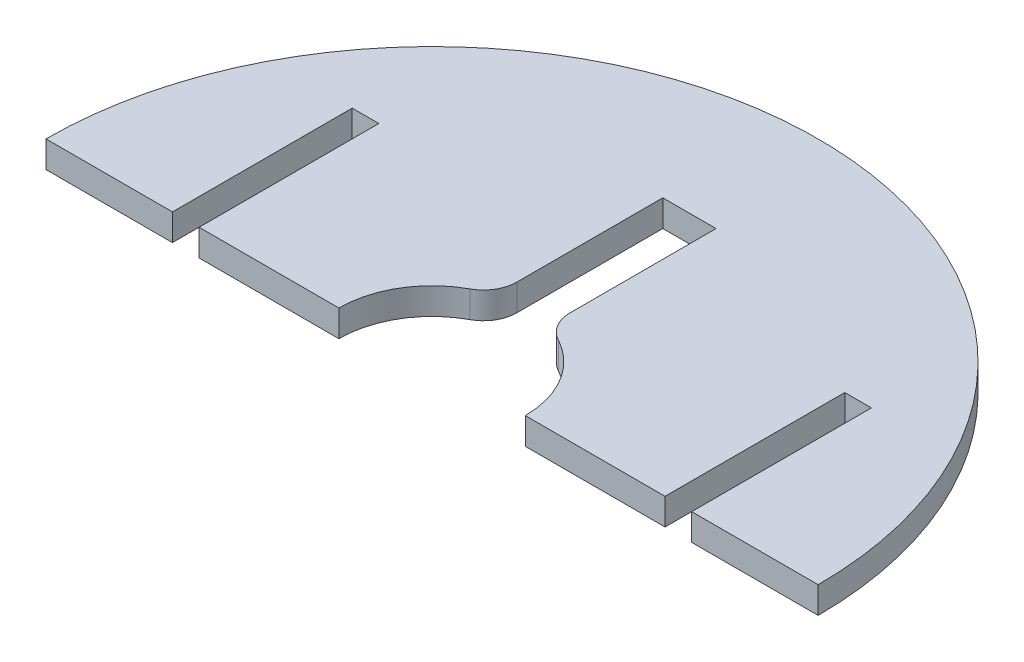
ISO-10303-21;
HEADER;
FILE_DESCRIPTION(('STEP AP214'),'2;1');
FILE_NAME('part.step','',(''),(''),'','','');
FILE_SCHEMA(('AUTOMOTIVE_DESIGN { 1 0 10303 214 1 1 1 1 }'));
ENDSEC;
DATA;
#1=APPLICATION_CONTEXT('core data for automotive mechanical design processes');
#2=APPLICATION_PROTOCOL_DEFINITION('international standard','automotive_design',2000,#1);
#3=PRODUCT_CONTEXT('',#1,'mechanical');
#4=PRODUCT('Part','Part','',(#3));
#5=PRODUCT_RELATED_PRODUCT_CATEGORY('part','',(#4));
#6=PRODUCT_DEFINITION_FORMATION('','',#4);
#7=PRODUCT_DEFINITION_CONTEXT('part definition',#1,'design');
#8=PRODUCT_DEFINITION('design','',#6,#7);
#9=PRODUCT_DEFINITION_SHAPE('','',#8);
#10=(LENGTH_UNIT() NAMED_UNIT(*) SI_UNIT(.MILLI.,.METRE.));
#11=(NAMED_UNIT(*) PLANE_ANGLE_UNIT() SI_UNIT($,.RADIAN.));
#12=(NAMED_UNIT(*) SI_UNIT($,.STERADIAN.) SOLID_ANGLE_UNIT());
#13=UNCERTAINTY_MEASURE_WITH_UNIT(LENGTH_MEASURE(1.E-05),#10,'distance_accuracy_value','');
#14=(GEOMETRIC_REPRESENTATION_CONTEXT(3) GLOBAL_UNCERTAINTY_ASSIGNED_CONTEXT((#13)) GLOBAL_UNIT_ASSIGNED_CONTEXT((#10,
#11,#12)) REPRESENTATION_CONTEXT('',''));
#15=CARTESIAN_POINT('',(0.,0.,0.));
#16=DIRECTION('',(0.,0.,1.));
#17=DIRECTION('',(1.,0.,0.));
#18=AXIS2_PLACEMENT_3D('',#15,#16,#17);
#19=CARTESIAN_POINT('',(-58.,4.,0.));
#20=DIRECTION('',(0.,0.,-1.));
#21=DIRECTION('',(-1.,0.,0.));
#22=AXIS2_PLACEMENT_3D('',#19,#20,#21);
#23=PLANE('',#22);
#24=DIRECTION('',(0.,1.,0.));
#25=VECTOR('',#24,1.);
#26=CARTESIAN_POINT('',(-14.,0.,0.));
#27=LINE('',#26,#25);
#28=CARTESIAN_POINT('',(-14.,0.,0.));
#29=VERTEX_POINT('',#28);
#30=CARTESIAN_POINT('',(-14.,4.,0.));
#31=VERTEX_POINT('',#30);
#32=EDGE_CURVE('E238',#29,#31,#27,.T.);
#33=ORIENTED_EDGE('',*,*,#32,.T.);
#34=DIRECTION('',(1.,0.,0.));
#35=VECTOR('',#34,1.);
#36=CARTESIAN_POINT('',(-58.,4.,0.));
#37=LINE('',#36,#35);
#38=CARTESIAN_POINT('',(-35.,4.,0.));
#39=VERTEX_POINT('',#38);
#40=EDGE_CURVE('E199',#39,#31,#37,.T.);
#41=ORIENTED_EDGE('',*,*,#40,.F.);
#42=DIRECTION('',(0.,1.,0.));
#43=VECTOR('',#42,1.);
#44=CARTESIAN_POINT('',(-35.,0.,0.));
#45=LINE('',#44,#43);
#46=CARTESIAN_POINT('',(-35.,0.,0.));
#47=VERTEX_POINT('',#46);
#48=EDGE_CURVE('E242',#47,#39,#45,.T.);
#49=ORIENTED_EDGE('',*,*,#48,.F.);
#50=DIRECTION('',(1.,0.,0.));
#51=VECTOR('',#50,1.);
#52=CARTESIAN_POINT('',(-58.,0.,0.));
#53=LINE('',#52,#51);
#54=EDGE_CURVE('E180',#47,#29,#53,.T.);
#55=ORIENTED_EDGE('',*,*,#54,.T.);
#56=EDGE_LOOP('',(#33,#41,#49,#55));
#57=FACE_BOUND('',#56,.T.);
#58=ADVANCED_FACE('F33',(#57),#23,.F.);
#59=CARTESIAN_POINT('',(0.,4.,0.));
#60=DIRECTION('',(0.,-1.,0.));
#61=DIRECTION('',(0.,0.,-1.));
#62=AXIS2_PLACEMENT_3D('',#59,#60,#61);
#63=PLANE('',#62);
#64=CARTESIAN_POINT('',(0.,4.,0.));
#65=DIRECTION('',(0.,1.,0.));
#66=DIRECTION('',(0.,0.,1.));
#67=AXIS2_PLACEMENT_3D('',#64,#65,#66);
#68=CIRCLE('',#67,14.);
#69=CARTESIAN_POINT('',(-6.63157894736842,4.,-12.329726706818));
#70=VERTEX_POINT('',#69);
#71=EDGE_CURVE('E167',#31,#70,#68,.F.);
#72=ORIENTED_EDGE('',*,*,#71,.T.);
#73=CARTESIAN_POINT('',(-9.,4.,-16.7332005306815));
#74=DIRECTION('',(0.,1.,0.));
#75=DIRECTION('',(0.,0.,1.));
#76=AXIS2_PLACEMENT_3D('',#73,#74,#75);
#77=CIRCLE('',#76,5.);
#78=CARTESIAN_POINT('',(-4.,4.,-16.7332005306815));
#79=VERTEX_POINT('',#78);
#80=EDGE_CURVE('E302',#70,#79,#77,.T.);
#81=ORIENTED_EDGE('',*,*,#80,.T.);
#82=DIRECTION('',(0.,0.,-1.));
#83=VECTOR('',#82,1.);
#84=CARTESIAN_POINT('',(-3.99999999999999,4.,0.));
#85=LINE('',#84,#83);
#86=CARTESIAN_POINT('',(-4.,4.,-38.6632005306815));
#87=VERTEX_POINT('',#86);
#88=EDGE_CURVE('E305',#79,#87,#85,.T.);
#89=ORIENTED_EDGE('',*,*,#88,.T.);
#90=DIRECTION('',(1.,0.,0.));
#91=VECTOR('',#90,1.);
#92=CARTESIAN_POINT('',(0.,4.,-38.6632005306815));
#93=LINE('',#92,#91);
#94=CARTESIAN_POINT('',(4.,4.,-38.6632005306815));
#95=VERTEX_POINT('',#94);
#96=EDGE_CURVE('E308',#87,#95,#93,.T.);
#97=ORIENTED_EDGE('',*,*,#96,.T.);
#98=DIRECTION('',(0.,0.,-1.));
#99=VECTOR('',#98,1.);
#100=CARTESIAN_POINT('',(4.,4.,0.));
#101=LINE('',#100,#99);
#102=CARTESIAN_POINT('',(4.,4.,-16.7332005306815));
#103=VERTEX_POINT('',#102);
#104=EDGE_CURVE('E311',#103,#95,#101,.T.);
#105=ORIENTED_EDGE('',*,*,#104,.F.);
#106=CARTESIAN_POINT('',(8.99999999999999,4.,-16.7332005306815));
#107=DIRECTION('',(0.,1.,0.));
#108=DIRECTION('',(0.,0.,1.));
#109=AXIS2_PLACEMENT_3D('',#106,#107,#108);
#110=CIRCLE('',#109,5.);
#111=CARTESIAN_POINT('',(6.63157894736842,4.,-12.329726706818));
#112=VERTEX_POINT('',#111);
#113=EDGE_CURVE('E314',#112,#103,#110,.F.);
#114=ORIENTED_EDGE('',*,*,#113,.F.);
#115=CARTESIAN_POINT('',(0.,4.,0.));
#116=DIRECTION('',(0.,1.,0.));
#117=DIRECTION('',(0.,0.,1.));
#118=AXIS2_PLACEMENT_3D('',#115,#116,#117);
#119=CIRCLE('',#118,14.);
#120=CARTESIAN_POINT('',(14.,4.,0.));
#121=VERTEX_POINT('',#120);
#122=EDGE_CURVE('E277',#121,#112,#119,.T.);
#123=ORIENTED_EDGE('',*,*,#122,.F.);
#124=CARTESIAN_POINT('',(35.,4.,0.));
#125=VERTEX_POINT('',#124);
#126=EDGE_CURVE('E174',#121,#125,#37,.T.);
#127=ORIENTED_EDGE('',*,*,#126,.T.);
#128=DIRECTION('',(0.,0.,1.));
#129=VECTOR('',#128,1.);
#130=CARTESIAN_POINT('',(35.,4.,0.));
#131=LINE('',#130,#129);
#132=CARTESIAN_POINT('',(35.,4.,-27.));
#133=VERTEX_POINT('',#132);
#134=EDGE_CURVE('E218',#133,#125,#131,.T.);
#135=ORIENTED_EDGE('',*,*,#134,.F.);
#136=DIRECTION('',(-1.,0.,0.));
#137=VECTOR('',#136,1.);
#138=CARTESIAN_POINT('',(35.,4.,-27.));
#139=LINE('',#138,#137);
#140=CARTESIAN_POINT('',(39.,4.,-27.));
#141=VERTEX_POINT('',#140);
#142=EDGE_CURVE('E281',#141,#133,#139,.T.);
#143=ORIENTED_EDGE('',*,*,#142,.F.);
#144=DIRECTION('',(0.,0.,-1.));
#145=VECTOR('',#144,1.);
#146=CARTESIAN_POINT('',(39.,4.,0.));
#147=LINE('',#146,#145);
#148=CARTESIAN_POINT('',(39.,4.,0.));
#149=VERTEX_POINT('',#148);
#150=EDGE_CURVE('E244',#149,#141,#147,.T.);
#151=ORIENTED_EDGE('',*,*,#150,.F.);
#152=CARTESIAN_POINT('',(58.,4.,0.));
#153=VERTEX_POINT('',#152);
#154=EDGE_CURVE('E192',#149,#153,#37,.T.);
#155=ORIENTED_EDGE('',*,*,#154,.T.);
#156=CARTESIAN_POINT('',(0.,4.,0.));
#157=DIRECTION('',(0.,1.,0.));
#158=DIRECTION('',(0.,0.,-1.));
#159=AXIS2_PLACEMENT_3D('',#156,#157,#158);
#160=CIRCLE('',#159,58.);
#161=CARTESIAN_POINT('',(-58.,4.,0.));
#162=VERTEX_POINT('',#161);
#163=EDGE_CURVE('E188',#153,#162,#160,.T.);
#164=ORIENTED_EDGE('',*,*,#163,.T.);
#165=CARTESIAN_POINT('',(-39.,4.,0.));
#166=VERTEX_POINT('',#165);
#167=EDGE_CURVE('E203',#162,#166,#37,.T.);
#168=ORIENTED_EDGE('',*,*,#167,.T.);
#169=DIRECTION('',(0.,0.,1.));
#170=VECTOR('',#169,1.);
#171=CARTESIAN_POINT('',(-39.,4.,0.));
#172=LINE('',#171,#170);
#173=CARTESIAN_POINT('',(-39.,4.,-27.));
#174=VERTEX_POINT('',#173);
#175=EDGE_CURVE('E228',#174,#166,#172,.T.);
#176=ORIENTED_EDGE('',*,*,#175,.F.);
#177=DIRECTION('',(-1.,0.,0.));
#178=VECTOR('',#177,1.);
#179=CARTESIAN_POINT('',(-35.,4.,-27.));
#180=LINE('',#179,#178);
#181=CARTESIAN_POINT('',(-35.,4.,-27.));
#182=VERTEX_POINT('',#181);
#183=EDGE_CURVE('E237',#182,#174,#180,.T.);
#184=ORIENTED_EDGE('',*,*,#183,.F.);
#185=DIRECTION('',(0.,0.,-1.));
#186=VECTOR('',#185,1.);
#187=CARTESIAN_POINT('',(-35.,4.,0.));
#188=LINE('',#187,#186);
#189=EDGE_CURVE('E234',#39,#182,#188,.T.);
#190=ORIENTED_EDGE('',*,*,#189,.F.);
#191=ORIENTED_EDGE('',*,*,#40,.T.);
#192=EDGE_LOOP('',(#72,#81,#89,#97,#105,#114,#123,#127,#135,#143,#151,#155,#164,#168,#176,#184,
#190,#191));
#193=FACE_BOUND('',#192,.T.);
#194=ADVANCED_FACE('F261',(#193),#63,.F.);
#195=CARTESIAN_POINT('',(0.,0.,0.));
#196=DIRECTION('',(0.,-1.,0.));
#197=DIRECTION('',(0.,0.,-1.));
#198=AXIS2_PLACEMENT_3D('',#195,#196,#197);
#199=PLANE('',#198);
#200=CARTESIAN_POINT('',(-9.,0.,-16.7332005306815));
#201=DIRECTION('',(0.,1.,0.));
#202=DIRECTION('',(0.,0.,1.));
#203=AXIS2_PLACEMENT_3D('',#200,#201,#202);
#204=CIRCLE('',#203,5.);
#205=CARTESIAN_POINT('',(-6.63157894736842,0.,-12.329726706818));
#206=VERTEX_POINT('',#205);
#207=CARTESIAN_POINT('',(-4.,0.,-16.7332005306815));
#208=VERTEX_POINT('',#207);
#209=EDGE_CURVE('E319',#206,#208,#204,.T.);
#210=ORIENTED_EDGE('',*,*,#209,.F.);
#211=CARTESIAN_POINT('',(0.,0.,0.));
#212=DIRECTION('',(0.,1.,0.));
#213=DIRECTION('',(0.,0.,1.));
#214=AXIS2_PLACEMENT_3D('',#211,#212,#213);
#215=CIRCLE('',#214,14.);
#216=EDGE_CURVE('E175',#29,#206,#215,.F.);
#217=ORIENTED_EDGE('',*,*,#216,.F.);
#218=ORIENTED_EDGE('',*,*,#54,.F.);
#219=DIRECTION('',(0.,0.,-1.));
#220=VECTOR('',#219,1.);
#221=CARTESIAN_POINT('',(-35.,0.,0.));
#222=LINE('',#221,#220);
#223=CARTESIAN_POINT('',(-35.,0.,-27.));
#224=VERTEX_POINT('',#223);
#225=EDGE_CURVE('E224',#47,#224,#222,.T.);
#226=ORIENTED_EDGE('',*,*,#225,.T.);
#227=DIRECTION('',(-1.,0.,0.));
#228=VECTOR('',#227,1.);
#229=CARTESIAN_POINT('',(-35.,0.,-27.));
#230=LINE('',#229,#228);
#231=CARTESIAN_POINT('',(-39.,0.,-27.));
#232=VERTEX_POINT('',#231);
#233=EDGE_CURVE('E227',#224,#232,#230,.T.);
#234=ORIENTED_EDGE('',*,*,#233,.T.);
#235=DIRECTION('',(0.,0.,1.));
#236=VECTOR('',#235,1.);
#237=CARTESIAN_POINT('',(-39.,0.,0.));
#238=LINE('',#237,#236);
#239=CARTESIAN_POINT('',(-39.,0.,0.));
#240=VERTEX_POINT('',#239);
#241=EDGE_CURVE('E231',#232,#240,#238,.T.);
#242=ORIENTED_EDGE('',*,*,#241,.T.);
#243=CARTESIAN_POINT('',(-58.,0.,0.));
#244=VERTEX_POINT('',#243);
#245=EDGE_CURVE('E183',#244,#240,#53,.T.);
#246=ORIENTED_EDGE('',*,*,#245,.F.);
#247=CARTESIAN_POINT('',(0.,0.,0.));
#248=DIRECTION('',(0.,1.,0.));
#249=DIRECTION('',(0.,0.,-1.));
#250=AXIS2_PLACEMENT_3D('',#247,#248,#249);
#251=CIRCLE('',#250,58.);
#252=CARTESIAN_POINT('',(58.,0.,0.));
#253=VERTEX_POINT('',#252);
#254=EDGE_CURVE('E185',#253,#244,#251,.T.);
#255=ORIENTED_EDGE('',*,*,#254,.F.);
#256=CARTESIAN_POINT('',(39.,0.,0.));
#257=VERTEX_POINT('',#256);
#258=EDGE_CURVE('E181',#257,#253,#53,.T.);
#259=ORIENTED_EDGE('',*,*,#258,.F.);
#260=DIRECTION('',(0.,0.,-1.));
#261=VECTOR('',#260,1.);
#262=CARTESIAN_POINT('',(39.,0.,0.));
#263=LINE('',#262,#261);
#264=CARTESIAN_POINT('',(39.,0.,-27.));
#265=VERTEX_POINT('',#264);
#266=EDGE_CURVE('E280',#257,#265,#263,.T.);
#267=ORIENTED_EDGE('',*,*,#266,.T.);
#268=DIRECTION('',(-1.,0.,0.));
#269=VECTOR('',#268,1.);
#270=CARTESIAN_POINT('',(35.,0.,-27.));
#271=LINE('',#270,#269);
#272=CARTESIAN_POINT('',(35.,0.,-27.));
#273=VERTEX_POINT('',#272);
#274=EDGE_CURVE('E282',#265,#273,#271,.T.);
#275=ORIENTED_EDGE('',*,*,#274,.T.);
#276=DIRECTION('',(0.,0.,1.));
#277=VECTOR('',#276,1.);
#278=CARTESIAN_POINT('',(35.,0.,0.));
#279=LINE('',#278,#277);
#280=CARTESIAN_POINT('',(35.,0.,0.));
#281=VERTEX_POINT('',#280);
#282=EDGE_CURVE('E56',#273,#281,#279,.T.);
#283=ORIENTED_EDGE('',*,*,#282,.T.);
#284=CARTESIAN_POINT('',(14.,0.,0.));
#285=VERTEX_POINT('',#284);
#286=EDGE_CURVE('E173',#285,#281,#53,.T.);
#287=ORIENTED_EDGE('',*,*,#286,.F.);
#288=CARTESIAN_POINT('',(0.,0.,0.));
#289=DIRECTION('',(0.,1.,0.));
#290=DIRECTION('',(0.,0.,1.));
#291=AXIS2_PLACEMENT_3D('',#288,#289,#290);
#292=CIRCLE('',#291,14.);
#293=CARTESIAN_POINT('',(6.63157894736842,0.,-12.329726706818));
#294=VERTEX_POINT('',#293);
#295=EDGE_CURVE('E158',#285,#294,#292,.T.);
#296=ORIENTED_EDGE('',*,*,#295,.T.);
#297=CARTESIAN_POINT('',(8.99999999999999,0.,-16.7332005306815));
#298=DIRECTION('',(0.,1.,0.));
#299=DIRECTION('',(0.,0.,1.));
#300=AXIS2_PLACEMENT_3D('',#297,#298,#299);
#301=CIRCLE('',#300,5.);
#302=CARTESIAN_POINT('',(4.,0.,-16.7332005306815));
#303=VERTEX_POINT('',#302);
#304=EDGE_CURVE('E48',#294,#303,#301,.F.);
#305=ORIENTED_EDGE('',*,*,#304,.T.);
#306=DIRECTION('',(0.,0.,-1.));
#307=VECTOR('',#306,1.);
#308=CARTESIAN_POINT('',(4.,0.,0.));
#309=LINE('',#308,#307);
#310=CARTESIAN_POINT('',(4.,0.,-38.6632005306815));
#311=VERTEX_POINT('',#310);
#312=EDGE_CURVE('E325',#303,#311,#309,.T.);
#313=ORIENTED_EDGE('',*,*,#312,.T.);
#314=DIRECTION('',(1.,0.,0.));
#315=VECTOR('',#314,1.);
#316=CARTESIAN_POINT('',(0.,0.,-38.6632005306815));
#317=LINE('',#316,#315);
#318=CARTESIAN_POINT('',(-4.,0.,-38.6632005306815));
#319=VERTEX_POINT('',#318);
#320=EDGE_CURVE('E323',#319,#311,#317,.T.);
#321=ORIENTED_EDGE('',*,*,#320,.F.);
#322=DIRECTION('',(0.,0.,-1.));
#323=VECTOR('',#322,1.);
#324=CARTESIAN_POINT('',(-3.99999999999999,0.,0.));
#325=LINE('',#324,#323);
#326=EDGE_CURVE('E321',#208,#319,#325,.T.);
#327=ORIENTED_EDGE('',*,*,#326,.F.);
#328=EDGE_LOOP('',(#210,#217,#218,#226,#234,#242,#246,#255,#259,#267,#275,#283,#287,#296,#305,
#313,#321,#327));
#329=FACE_BOUND('',#328,.T.);
#330=ADVANCED_FACE('F178',(#329),#199,.T.);
#331=ORIENTED_EDGE('',*,*,#154,.F.);
#332=DIRECTION('',(0.,1.,0.));
#333=VECTOR('',#332,1.);
#334=CARTESIAN_POINT('',(39.,0.,0.));
#335=LINE('',#334,#333);
#336=EDGE_CURVE('E205',#257,#149,#335,.T.);
#337=ORIENTED_EDGE('',*,*,#336,.F.);
#338=ORIENTED_EDGE('',*,*,#258,.T.);
#339=DIRECTION('',(0.,-1.,0.));
#340=VECTOR('',#339,1.);
#341=CARTESIAN_POINT('',(58.,4.,0.));
#342=LINE('',#341,#340);
#343=EDGE_CURVE('E41',#153,#253,#342,.T.);
#344=ORIENTED_EDGE('',*,*,#343,.F.);
#345=EDGE_LOOP('',(#331,#337,#338,#344));
#346=FACE_BOUND('',#345,.T.);
#347=ADVANCED_FACE('F359',(#346),#23,.F.);
#348=ORIENTED_EDGE('',*,*,#126,.F.);
#349=DIRECTION('',(0.,1.,0.));
#350=VECTOR('',#349,1.);
#351=CARTESIAN_POINT('',(14.,0.,0.));
#352=LINE('',#351,#350);
#353=EDGE_CURVE('E162',#285,#121,#352,.T.);
#354=ORIENTED_EDGE('',*,*,#353,.F.);
#355=ORIENTED_EDGE('',*,*,#286,.T.);
#356=DIRECTION('',(0.,1.,0.));
#357=VECTOR('',#356,1.);
#358=CARTESIAN_POINT('',(35.,0.,0.));
#359=LINE('',#358,#357);
#360=EDGE_CURVE('E209',#281,#125,#359,.T.);
#361=ORIENTED_EDGE('',*,*,#360,.T.);
#362=EDGE_LOOP('',(#348,#354,#355,#361));
#363=FACE_BOUND('',#362,.T.);
#364=ADVANCED_FACE('F171',(#363),#23,.F.);
#365=CARTESIAN_POINT('',(0.,4.,0.));
#366=DIRECTION('',(0.,-1.,0.));
#367=DIRECTION('',(0.,0.,-1.));
#368=AXIS2_PLACEMENT_3D('',#365,#366,#367);
#369=CYLINDRICAL_SURFACE('',#368,58.);
#370=ORIENTED_EDGE('',*,*,#254,.T.);
#371=DIRECTION('',(0.,-1.,0.));
#372=VECTOR('',#371,1.);
#373=CARTESIAN_POINT('',(-58.,4.,0.));
#374=LINE('',#373,#372);
#375=EDGE_CURVE('E11',#162,#244,#374,.T.);
#376=ORIENTED_EDGE('',*,*,#375,.F.);
#377=ORIENTED_EDGE('',*,*,#163,.F.);
#378=ORIENTED_EDGE('',*,*,#343,.T.);
#379=EDGE_LOOP('',(#370,#376,#377,#378));
#380=FACE_BOUND('',#379,.T.);
#381=ADVANCED_FACE('F35',(#380),#369,.T.);
#382=ORIENTED_EDGE('',*,*,#245,.T.);
#383=DIRECTION('',(0.,1.,0.));
#384=VECTOR('',#383,1.);
#385=CARTESIAN_POINT('',(-39.,0.,0.));
#386=LINE('',#385,#384);
#387=EDGE_CURVE('E245',#240,#166,#386,.T.);
#388=ORIENTED_EDGE('',*,*,#387,.T.);
#389=ORIENTED_EDGE('',*,*,#167,.F.);
#390=ORIENTED_EDGE('',*,*,#375,.T.);
#391=EDGE_LOOP('',(#382,#388,#389,#390));
#392=FACE_BOUND('',#391,.T.);
#393=ADVANCED_FACE('F263',(#392),#23,.F.);
#394=CARTESIAN_POINT('',(-35.,0.,0.));
#395=DIRECTION('',(1.,0.,0.));
#396=DIRECTION('',(0.,0.,-1.));
#397=AXIS2_PLACEMENT_3D('',#394,#395,#396);
#398=PLANE('',#397);
#399=ORIENTED_EDGE('',*,*,#189,.T.);
#400=DIRECTION('',(0.,1.,0.));
#401=VECTOR('',#400,1.);
#402=CARTESIAN_POINT('',(-35.,0.,-27.));
#403=LINE('',#402,#401);
#404=EDGE_CURVE('E201',#224,#182,#403,.T.);
#405=ORIENTED_EDGE('',*,*,#404,.F.);
#406=ORIENTED_EDGE('',*,*,#225,.F.);
#407=ORIENTED_EDGE('',*,*,#48,.T.);
#408=EDGE_LOOP('',(#399,#405,#406,#407));
#409=FACE_BOUND('',#408,.T.);
#410=ADVANCED_FACE('F256',(#409),#398,.F.);
#411=CARTESIAN_POINT('',(-39.,0.,0.));
#412=DIRECTION('',(-1.,0.,0.));
#413=DIRECTION('',(0.,0.,1.));
#414=AXIS2_PLACEMENT_3D('',#411,#412,#413);
#415=PLANE('',#414);
#416=ORIENTED_EDGE('',*,*,#175,.T.);
#417=ORIENTED_EDGE('',*,*,#387,.F.);
#418=ORIENTED_EDGE('',*,*,#241,.F.);
#419=DIRECTION('',(0.,1.,0.));
#420=VECTOR('',#419,1.);
#421=CARTESIAN_POINT('',(-39.,0.,-27.));
#422=LINE('',#421,#420);
#423=EDGE_CURVE('E246',#232,#174,#422,.T.);
#424=ORIENTED_EDGE('',*,*,#423,.T.);
#425=EDGE_LOOP('',(#416,#417,#418,#424));
#426=FACE_BOUND('',#425,.T.);
#427=ADVANCED_FACE('F262',(#426),#415,.F.);
#428=CARTESIAN_POINT('',(-35.,0.,-27.));
#429=DIRECTION('',(0.,0.,-1.));
#430=DIRECTION('',(-1.,0.,0.));
#431=AXIS2_PLACEMENT_3D('',#428,#429,#430);
#432=PLANE('',#431);
#433=ORIENTED_EDGE('',*,*,#183,.T.);
#434=ORIENTED_EDGE('',*,*,#423,.F.);
#435=ORIENTED_EDGE('',*,*,#233,.F.);
#436=ORIENTED_EDGE('',*,*,#404,.T.);
#437=EDGE_LOOP('',(#433,#434,#435,#436));
#438=FACE_BOUND('',#437,.T.);
#439=ADVANCED_FACE('F251',(#438),#432,.F.);
#440=CARTESIAN_POINT('',(39.,0.,0.));
#441=DIRECTION('',(1.,0.,0.));
#442=DIRECTION('',(0.,0.,-1.));
#443=AXIS2_PLACEMENT_3D('',#440,#441,#442);
#444=PLANE('',#443);
#445=ORIENTED_EDGE('',*,*,#150,.T.);
#446=DIRECTION('',(0.,1.,0.));
#447=VECTOR('',#446,1.);
#448=CARTESIAN_POINT('',(39.,0.,-27.));
#449=LINE('',#448,#447);
#450=EDGE_CURVE('E222',#265,#141,#449,.T.);
#451=ORIENTED_EDGE('',*,*,#450,.F.);
#452=ORIENTED_EDGE('',*,*,#266,.F.);
#453=ORIENTED_EDGE('',*,*,#336,.T.);
#454=EDGE_LOOP('',(#445,#451,#452,#453));
#455=FACE_BOUND('',#454,.T.);
#456=ADVANCED_FACE('F452',(#455),#444,.F.);
#457=CARTESIAN_POINT('',(35.,0.,0.));
#458=DIRECTION('',(-1.,0.,0.));
#459=DIRECTION('',(0.,0.,1.));
#460=AXIS2_PLACEMENT_3D('',#457,#458,#459);
#461=PLANE('',#460);
#462=ORIENTED_EDGE('',*,*,#134,.T.);
#463=ORIENTED_EDGE('',*,*,#360,.F.);
#464=ORIENTED_EDGE('',*,*,#282,.F.);
#465=DIRECTION('',(0.,1.,0.));
#466=VECTOR('',#465,1.);
#467=CARTESIAN_POINT('',(35.,0.,-27.));
#468=LINE('',#467,#466);
#469=EDGE_CURVE('E215',#273,#133,#468,.T.);
#470=ORIENTED_EDGE('',*,*,#469,.T.);
#471=EDGE_LOOP('',(#462,#463,#464,#470));
#472=FACE_BOUND('',#471,.T.);
#473=ADVANCED_FACE('F278',(#472),#461,.F.);
#474=CARTESIAN_POINT('',(35.,0.,-27.));
#475=DIRECTION('',(0.,0.,-1.));
#476=DIRECTION('',(-1.,0.,0.));
#477=AXIS2_PLACEMENT_3D('',#474,#475,#476);
#478=PLANE('',#477);
#479=ORIENTED_EDGE('',*,*,#142,.T.);
#480=ORIENTED_EDGE('',*,*,#469,.F.);
#481=ORIENTED_EDGE('',*,*,#274,.F.);
#482=ORIENTED_EDGE('',*,*,#450,.T.);
#483=EDGE_LOOP('',(#479,#480,#481,#482));
#484=FACE_BOUND('',#483,.T.);
#485=ADVANCED_FACE('F386',(#484),#478,.F.);
#486=CARTESIAN_POINT('',(0.,0.,0.));
#487=DIRECTION('',(0.,1.,0.));
#488=DIRECTION('',(0.,0.,1.));
#489=AXIS2_PLACEMENT_3D('',#486,#487,#488);
#490=CYLINDRICAL_SURFACE('',#489,14.);
#491=ORIENTED_EDGE('',*,*,#71,.F.);
#492=ORIENTED_EDGE('',*,*,#32,.F.);
#493=ORIENTED_EDGE('',*,*,#216,.T.);
#494=DIRECTION('',(0.,1.,0.));
#495=VECTOR('',#494,1.);
#496=CARTESIAN_POINT('',(-6.63157894736842,0.,-12.329726706818));
#497=LINE('',#496,#495);
#498=EDGE_CURVE('E298',#206,#70,#497,.T.);
#499=ORIENTED_EDGE('',*,*,#498,.T.);
#500=EDGE_LOOP('',(#491,#492,#493,#499));
#501=FACE_BOUND('',#500,.T.);
#502=ADVANCED_FACE('F348',(#501),#490,.F.);
#503=CARTESIAN_POINT('',(-9.,0.,-16.7332005306815));
#504=DIRECTION('',(0.,1.,0.));
#505=DIRECTION('',(0.,0.,1.));
#506=AXIS2_PLACEMENT_3D('',#503,#504,#505);
#507=CYLINDRICAL_SURFACE('',#506,5.);
#508=ORIENTED_EDGE('',*,*,#80,.F.);
#509=ORIENTED_EDGE('',*,*,#498,.F.);
#510=ORIENTED_EDGE('',*,*,#209,.T.);
#511=DIRECTION('',(0.,1.,0.));
#512=VECTOR('',#511,1.);
#513=CARTESIAN_POINT('',(-4.,0.,-16.7332005306815));
#514=LINE('',#513,#512);
#515=EDGE_CURVE('E296',#208,#79,#514,.T.);
#516=ORIENTED_EDGE('',*,*,#515,.T.);
#517=EDGE_LOOP('',(#508,#509,#510,#516));
#518=FACE_BOUND('',#517,.T.);
#519=ADVANCED_FACE('F346',(#518),#507,.T.);
#520=CARTESIAN_POINT('',(-3.99999999999999,0.,0.));
#521=DIRECTION('',(1.,0.,0.));
#522=DIRECTION('',(0.,0.,-1.));
#523=AXIS2_PLACEMENT_3D('',#520,#521,#522);
#524=PLANE('',#523);
#525=ORIENTED_EDGE('',*,*,#88,.F.);
#526=ORIENTED_EDGE('',*,*,#515,.F.);
#527=ORIENTED_EDGE('',*,*,#326,.T.);
#528=DIRECTION('',(0.,1.,0.));
#529=VECTOR('',#528,1.);
#530=CARTESIAN_POINT('',(-4.,0.,-38.6632005306815));
#531=LINE('',#530,#529);
#532=EDGE_CURVE('E294',#319,#87,#531,.T.);
#533=ORIENTED_EDGE('',*,*,#532,.T.);
#534=EDGE_LOOP('',(#525,#526,#527,#533));
#535=FACE_BOUND('',#534,.T.);
#536=ADVANCED_FACE('F341',(#535),#524,.T.);
#537=CARTESIAN_POINT('',(0.,0.,-38.6632005306815));
#538=DIRECTION('',(0.,0.,1.));
#539=DIRECTION('',(1.,0.,0.));
#540=AXIS2_PLACEMENT_3D('',#537,#538,#539);
#541=PLANE('',#540);
#542=ORIENTED_EDGE('',*,*,#96,.F.);
#543=ORIENTED_EDGE('',*,*,#532,.F.);
#544=ORIENTED_EDGE('',*,*,#320,.T.);
#545=DIRECTION('',(0.,1.,0.));
#546=VECTOR('',#545,1.);
#547=CARTESIAN_POINT('',(4.,0.,-38.6632005306815));
#548=LINE('',#547,#546);
#549=EDGE_CURVE('E292',#311,#95,#548,.T.);
#550=ORIENTED_EDGE('',*,*,#549,.T.);
#551=EDGE_LOOP('',(#542,#543,#544,#550));
#552=FACE_BOUND('',#551,.T.);
#553=ADVANCED_FACE('F337',(#552),#541,.T.);
#554=CARTESIAN_POINT('',(4.,0.,0.));
#555=DIRECTION('',(1.,0.,0.));
#556=DIRECTION('',(0.,0.,-1.));
#557=AXIS2_PLACEMENT_3D('',#554,#555,#556);
#558=PLANE('',#557);
#559=ORIENTED_EDGE('',*,*,#104,.T.);
#560=ORIENTED_EDGE('',*,*,#549,.F.);
#561=ORIENTED_EDGE('',*,*,#312,.F.);
#562=DIRECTION('',(0.,1.,0.));
#563=VECTOR('',#562,1.);
#564=CARTESIAN_POINT('',(4.,0.,-16.7332005306815));
#565=LINE('',#564,#563);
#566=EDGE_CURVE('E290',#303,#103,#565,.T.);
#567=ORIENTED_EDGE('',*,*,#566,.T.);
#568=EDGE_LOOP('',(#559,#560,#561,#567));
#569=FACE_BOUND('',#568,.T.);
#570=ADVANCED_FACE('F333',(#569),#558,.F.);
#571=CARTESIAN_POINT('',(8.99999999999999,0.,-16.7332005306815));
#572=DIRECTION('',(0.,1.,0.));
#573=DIRECTION('',(0.,0.,1.));
#574=AXIS2_PLACEMENT_3D('',#571,#572,#573);
#575=CYLINDRICAL_SURFACE('',#574,5.);
#576=ORIENTED_EDGE('',*,*,#113,.T.);
#577=ORIENTED_EDGE('',*,*,#566,.F.);
#578=ORIENTED_EDGE('',*,*,#304,.F.);
#579=DIRECTION('',(0.,1.,0.));
#580=VECTOR('',#579,1.);
#581=CARTESIAN_POINT('',(6.63157894736842,0.,-12.329726706818));
#582=LINE('',#581,#580);
#583=EDGE_CURVE('E164',#294,#112,#582,.T.);
#584=ORIENTED_EDGE('',*,*,#583,.T.);
#585=EDGE_LOOP('',(#576,#577,#578,#584));
#586=FACE_BOUND('',#585,.T.);
#587=ADVANCED_FACE('F349',(#586),#575,.T.);
#588=CARTESIAN_POINT('',(0.,0.,0.));
#589=DIRECTION('',(0.,1.,0.));
#590=DIRECTION('',(0.,0.,1.));
#591=AXIS2_PLACEMENT_3D('',#588,#589,#590);
#592=CYLINDRICAL_SURFACE('',#591,14.);
#593=ORIENTED_EDGE('',*,*,#122,.T.);
#594=ORIENTED_EDGE('',*,*,#583,.F.);
#595=ORIENTED_EDGE('',*,*,#295,.F.);
#596=ORIENTED_EDGE('',*,*,#353,.T.);
#597=EDGE_LOOP('',(#593,#594,#595,#596));
#598=FACE_BOUND('',#597,.T.);
#599=ADVANCED_FACE('F161',(#598),#592,.F.);
#600=CLOSED_SHELL('',(#58,#194,#330,#347,#364,#381,#393,#410,#427,#439,#456,#473,#485,#502,#519,
#536,#553,#570,#587,#599));
#601=MANIFOLD_SOLID_BREP('B2',#600);
#602=ADVANCED_BREP_SHAPE_REPRESENTATION('',(#18,#601),#14);
#603=SHAPE_DEFINITION_REPRESENTATION(#9,#602);
ENDSEC;
END-ISO-10303-21;
